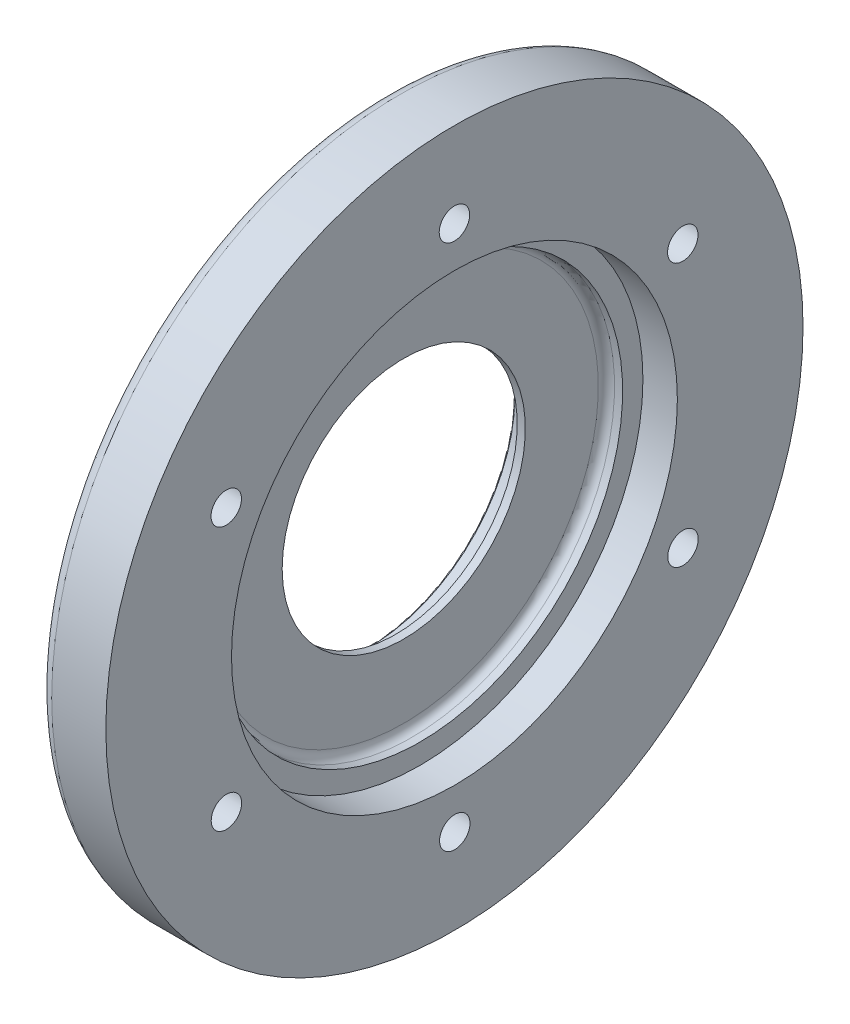
ISO-10303-21;
HEADER;
FILE_DESCRIPTION(('STEP AP214'),'2;1');
FILE_NAME('part.step','',(''),(''),'','','');
FILE_SCHEMA(('AUTOMOTIVE_DESIGN { 1 0 10303 214 1 1 1 1 }'));
ENDSEC;
DATA;
#1=APPLICATION_CONTEXT('core data for automotive mechanical design processes');
#2=APPLICATION_PROTOCOL_DEFINITION('international standard','automotive_design',2000,#1);
#3=PRODUCT_CONTEXT('',#1,'mechanical');
#4=PRODUCT('Part','Part','',(#3));
#5=PRODUCT_RELATED_PRODUCT_CATEGORY('part','',(#4));
#6=PRODUCT_DEFINITION_FORMATION('','',#4);
#7=PRODUCT_DEFINITION_CONTEXT('part definition',#1,'design');
#8=PRODUCT_DEFINITION('design','',#6,#7);
#9=PRODUCT_DEFINITION_SHAPE('','',#8);
#10=(LENGTH_UNIT() NAMED_UNIT(*) SI_UNIT(.MILLI.,.METRE.));
#11=(NAMED_UNIT(*) PLANE_ANGLE_UNIT() SI_UNIT($,.RADIAN.));
#12=(NAMED_UNIT(*) SI_UNIT($,.STERADIAN.) SOLID_ANGLE_UNIT());
#13=UNCERTAINTY_MEASURE_WITH_UNIT(LENGTH_MEASURE(1.E-05),#10,'distance_accuracy_value','');
#14=(GEOMETRIC_REPRESENTATION_CONTEXT(3) GLOBAL_UNCERTAINTY_ASSIGNED_CONTEXT((#13)) GLOBAL_UNIT_ASSIGNED_CONTEXT((#10,
#11,#12)) REPRESENTATION_CONTEXT('',''));
#15=CARTESIAN_POINT('',(0.,0.,0.));
#16=DIRECTION('',(0.,0.,1.));
#17=DIRECTION('',(1.,0.,0.));
#18=AXIS2_PLACEMENT_3D('',#15,#16,#17);
#19=CARTESIAN_POINT('',(0.595225647379466,0.,-36.));
#20=DIRECTION('',(1.,0.,0.));
#21=DIRECTION('',(0.,0.,-1.));
#22=AXIS2_PLACEMENT_3D('',#19,#20,#21);
#23=PLANE('',#22);
#24=CARTESIAN_POINT('',(0.595225647379467,0.,0.));
#25=DIRECTION('',(-1.,0.,0.));
#26=DIRECTION('',(0.,0.,1.));
#27=AXIS2_PLACEMENT_3D('',#24,#25,#26);
#28=CIRCLE('',#27,30.);
#29=CARTESIAN_POINT('',(0.595225647379467,0.,30.));
#30=VERTEX_POINT('',#29);
#31=EDGE_CURVE('E139',#30,#30,#28,.T.);
#32=ORIENTED_EDGE('',*,*,#31,.F.);
#33=EDGE_LOOP('',(#32));
#34=FACE_BOUND('',#33,.T.);
#35=CARTESIAN_POINT('',(0.595225647379466,0.,0.));
#36=DIRECTION('',(-1.,0.,0.));
#37=DIRECTION('',(0.,0.,1.));
#38=AXIS2_PLACEMENT_3D('',#35,#36,#37);
#39=CIRCLE('',#38,36.);
#40=CARTESIAN_POINT('',(0.595225647379466,0.,36.));
#41=VERTEX_POINT('',#40);
#42=EDGE_CURVE('E178',#41,#41,#39,.T.);
#43=ORIENTED_EDGE('',*,*,#42,.T.);
#44=EDGE_LOOP('',(#43));
#45=FACE_BOUND('',#44,.T.);
#46=ADVANCED_FACE('F47',(#34,#45),#23,.F.);
#47=CARTESIAN_POINT('',(0.,0.,0.));
#48=DIRECTION('',(-1.,0.,0.));
#49=DIRECTION('',(0.,0.,1.));
#50=AXIS2_PLACEMENT_3D('',#47,#48,#49);
#51=CYLINDRICAL_SURFACE('',#50,36.);
#52=CARTESIAN_POINT('',(-5.90477435262053,0.,0.));
#53=DIRECTION('',(1.,0.,0.));
#54=DIRECTION('',(0.,0.,-1.));
#55=AXIS2_PLACEMENT_3D('',#52,#53,#54);
#56=CIRCLE('',#55,36.);
#57=CARTESIAN_POINT('',(-5.90477435262053,0.,-36.));
#58=VERTEX_POINT('',#57);
#59=EDGE_CURVE('E62',#58,#58,#56,.F.);
#60=ORIENTED_EDGE('',*,*,#59,.T.);
#61=EDGE_LOOP('',(#60));
#62=FACE_BOUND('',#61,.T.);
#63=ORIENTED_EDGE('',*,*,#42,.F.);
#64=EDGE_LOOP('',(#63));
#65=FACE_BOUND('',#64,.T.);
#66=ADVANCED_FACE('F185',(#62,#65),#51,.F.);
#67=CARTESIAN_POINT('',(-6.40477435262053,0.,-46.));
#68=DIRECTION('',(1.,0.,0.));
#69=DIRECTION('',(0.,0.,-1.));
#70=AXIS2_PLACEMENT_3D('',#67,#68,#69);
#71=PLANE('',#70);
#72=CARTESIAN_POINT('',(-6.40477435262053,0.,0.));
#73=DIRECTION('',(1.,0.,0.));
#74=DIRECTION('',(0.,0.,-1.));
#75=AXIS2_PLACEMENT_3D('',#72,#73,#74);
#76=CIRCLE('',#75,36.5);
#77=CARTESIAN_POINT('',(-6.40477435262053,0.,-36.5));
#78=VERTEX_POINT('',#77);
#79=EDGE_CURVE('E56',#78,#78,#76,.T.);
#80=ORIENTED_EDGE('',*,*,#79,.T.);
#81=EDGE_LOOP('',(#80));
#82=FACE_BOUND('',#81,.T.);
#83=CARTESIAN_POINT('',(-6.40477435262053,0.,0.));
#84=DIRECTION('',(-1.,0.,0.));
#85=DIRECTION('',(0.,0.,1.));
#86=AXIS2_PLACEMENT_3D('',#83,#84,#85);
#87=CIRCLE('',#86,46.);
#88=CARTESIAN_POINT('',(-6.40477435262053,0.,46.));
#89=VERTEX_POINT('',#88);
#90=EDGE_CURVE('E174',#89,#89,#87,.T.);
#91=ORIENTED_EDGE('',*,*,#90,.T.);
#92=EDGE_LOOP('',(#91));
#93=FACE_BOUND('',#92,.T.);
#94=ADVANCED_FACE('F208',(#82,#93),#71,.F.);
#95=CARTESIAN_POINT('',(0.,0.,0.));
#96=DIRECTION('',(-1.,0.,0.));
#97=DIRECTION('',(0.,0.,1.));
#98=AXIS2_PLACEMENT_3D('',#95,#96,#97);
#99=CYLINDRICAL_SURFACE('',#98,46.);
#100=ORIENTED_EDGE('',*,*,#90,.F.);
#101=EDGE_LOOP('',(#100));
#102=FACE_BOUND('',#101,.T.);
#103=CARTESIAN_POINT('',(-5.25563941521427,0.,0.));
#104=DIRECTION('',(-1.,0.,0.));
#105=DIRECTION('',(0.,0.,1.));
#106=AXIS2_PLACEMENT_3D('',#103,#104,#105);
#107=CIRCLE('',#106,46.);
#108=CARTESIAN_POINT('',(-5.25563941521427,0.,46.));
#109=VERTEX_POINT('',#108);
#110=EDGE_CURVE('E170',#109,#109,#107,.T.);
#111=ORIENTED_EDGE('',*,*,#110,.T.);
#112=EDGE_LOOP('',(#111));
#113=FACE_BOUND('',#112,.T.);
#114=ADVANCED_FACE('F215',(#102,#113),#99,.T.);
#115=CARTESIAN_POINT('',(-5.25563941521427,0.,0.));
#116=DIRECTION('',(-1.,0.,0.));
#117=DIRECTION('',(0.,0.,1.));
#118=AXIS2_PLACEMENT_3D('',#115,#116,#117);
#119=TOROIDAL_SURFACE('',#118,49.,3.);
#120=ORIENTED_EDGE('',*,*,#110,.F.);
#121=EDGE_LOOP('',(#120));
#122=FACE_BOUND('',#121,.T.);
#123=CARTESIAN_POINT('',(-2.25563941521427,0.,0.));
#124=DIRECTION('',(-1.,0.,0.));
#125=DIRECTION('',(0.,0.,1.));
#126=AXIS2_PLACEMENT_3D('',#123,#124,#125);
#127=CIRCLE('',#126,49.);
#128=CARTESIAN_POINT('',(-2.25563941521427,0.,49.));
#129=VERTEX_POINT('',#128);
#130=EDGE_CURVE('E166',#129,#129,#127,.T.);
#131=ORIENTED_EDGE('',*,*,#130,.T.);
#132=EDGE_LOOP('',(#131));
#133=FACE_BOUND('',#132,.T.);
#134=ADVANCED_FACE('F219',(#122,#133),#119,.F.);
#135=CARTESIAN_POINT('',(-2.25563941521427,0.,-86.));
#136=DIRECTION('',(1.,0.,0.));
#137=DIRECTION('',(0.,0.,-1.));
#138=AXIS2_PLACEMENT_3D('',#135,#136,#137);
#139=PLANE('',#138);
#140=CARTESIAN_POINT('',(-2.25563941521428,65.0505102572168,0.));
#141=DIRECTION('',(-1.,0.,0.));
#142=DIRECTION('',(0.,0.,1.));
#143=AXIS2_PLACEMENT_3D('',#140,#141,#142);
#144=CIRCLE('',#143,5.99999999999999);
#145=CARTESIAN_POINT('',(-2.25563941521428,65.0505102572168,5.99999999999999));
#146=VERTEX_POINT('',#145);
#147=EDGE_CURVE('E308',#146,#146,#144,.T.);
#148=ORIENTED_EDGE('',*,*,#147,.F.);
#149=EDGE_LOOP('',(#148));
#150=FACE_BOUND('',#149,.T.);
#151=CARTESIAN_POINT('',(-2.25563941521428,32.5000000000024,56.2916512459899));
#152=DIRECTION('',(-1.,0.,0.));
#153=DIRECTION('',(0.,0.,1.));
#154=AXIS2_PLACEMENT_3D('',#151,#152,#153);
#155=CIRCLE('',#154,5.99999999999999);
#156=CARTESIAN_POINT('',(-2.25563941521428,32.5000000000024,62.2916512459899));
#157=VERTEX_POINT('',#156);
#158=EDGE_CURVE('E101',#157,#157,#155,.T.);
#159=ORIENTED_EDGE('',*,*,#158,.F.);
#160=EDGE_LOOP('',(#159));
#161=FACE_BOUND('',#160,.T.);
#162=CARTESIAN_POINT('',(-2.25563941521428,-32.525255128606,56.2479080800912));
#163=DIRECTION('',(-1.,0.,0.));
#164=DIRECTION('',(0.,0.,1.));
#165=AXIS2_PLACEMENT_3D('',#162,#163,#164);
#166=CIRCLE('',#165,5.99999999999999);
#167=CARTESIAN_POINT('',(-2.25563941521428,-32.525255128606,62.2479080800912));
#168=VERTEX_POINT('',#167);
#169=EDGE_CURVE('E92',#168,#168,#166,.T.);
#170=ORIENTED_EDGE('',*,*,#169,.F.);
#171=EDGE_LOOP('',(#170));
#172=FACE_BOUND('',#171,.T.);
#173=CARTESIAN_POINT('',(-2.25563941521428,-65.,-0.087486331797387));
#174=DIRECTION('',(-1.,0.,0.));
#175=DIRECTION('',(0.,0.,1.));
#176=AXIS2_PLACEMENT_3D('',#173,#174,#175);
#177=CIRCLE('',#176,5.99999999999999);
#178=CARTESIAN_POINT('',(-2.25563941521428,-65.,5.9125136682026));
#179=VERTEX_POINT('',#178);
#180=EDGE_CURVE('E87',#179,#179,#177,.T.);
#181=ORIENTED_EDGE('',*,*,#180,.F.);
#182=EDGE_LOOP('',(#181));
#183=FACE_BOUND('',#182,.T.);
#184=CARTESIAN_POINT('',(-2.25563941521428,-32.4494897427856,-56.3791375777873));
#185=DIRECTION('',(-1.,0.,0.));
#186=DIRECTION('',(0.,0.,1.));
#187=AXIS2_PLACEMENT_3D('',#184,#185,#186);
#188=CIRCLE('',#187,5.99999999999999);
#189=CARTESIAN_POINT('',(-2.25563941521428,-32.4494897427856,-50.3791375777873));
#190=VERTEX_POINT('',#189);
#191=EDGE_CURVE('E82',#190,#190,#188,.T.);
#192=ORIENTED_EDGE('',*,*,#191,.F.);
#193=EDGE_LOOP('',(#192));
#194=FACE_BOUND('',#193,.T.);
#195=CARTESIAN_POINT('',(-2.25563941521428,32.5757653858228,-56.3353944118886));
#196=DIRECTION('',(-1.,0.,0.));
#197=DIRECTION('',(0.,0.,1.));
#198=AXIS2_PLACEMENT_3D('',#195,#196,#197);
#199=CIRCLE('',#198,5.99999999999998);
#200=CARTESIAN_POINT('',(-2.25563941521428,32.5757653858228,-50.3353944118886));
#201=VERTEX_POINT('',#200);
#202=EDGE_CURVE('E76',#201,#201,#199,.T.);
#203=ORIENTED_EDGE('',*,*,#202,.F.);
#204=EDGE_LOOP('',(#203));
#205=FACE_BOUND('',#204,.T.);
#206=CARTESIAN_POINT('',(-2.25563941521427,0.,0.));
#207=DIRECTION('',(1.,0.,0.));
#208=DIRECTION('',(0.,0.,-1.));
#209=AXIS2_PLACEMENT_3D('',#206,#207,#208);
#210=CIRCLE('',#209,81.1010205144336);
#211=CARTESIAN_POINT('',(-2.25563941521427,0.,-81.1010205144336));
#212=VERTEX_POINT('',#211);
#213=EDGE_CURVE('E10',#212,#212,#210,.F.);
#214=ORIENTED_EDGE('',*,*,#213,.T.);
#215=EDGE_LOOP('',(#214));
#216=FACE_BOUND('',#215,.T.);
#217=ORIENTED_EDGE('',*,*,#130,.F.);
#218=EDGE_LOOP('',(#217));
#219=FACE_BOUND('',#218,.T.);
#220=ADVANCED_FACE('F223',(#150,#161,#172,#183,#194,#205,#216,#219),#139,.F.);
#221=CARTESIAN_POINT('',(6.59522564737947,0.,-50.));
#222=DIRECTION('',(-1.,0.,0.));
#223=DIRECTION('',(0.,0.,1.));
#224=AXIS2_PLACEMENT_3D('',#221,#222,#223);
#225=PLANE('',#224);
#226=CARTESIAN_POINT('',(6.59522564737947,0.,0.));
#227=DIRECTION('',(-1.,0.,0.));
#228=DIRECTION('',(0.,0.,1.));
#229=AXIS2_PLACEMENT_3D('',#226,#227,#228);
#230=CIRCLE('',#229,55.);
#231=CARTESIAN_POINT('',(6.59522564737947,0.,55.));
#232=VERTEX_POINT('',#231);
#233=EDGE_CURVE('E162',#232,#232,#230,.T.);
#234=ORIENTED_EDGE('',*,*,#233,.F.);
#235=EDGE_LOOP('',(#234));
#236=FACE_BOUND('',#235,.T.);
#237=CARTESIAN_POINT('',(6.59522564737947,0.,0.));
#238=DIRECTION('',(-1.,0.,0.));
#239=DIRECTION('',(0.,0.,1.));
#240=AXIS2_PLACEMENT_3D('',#237,#238,#239);
#241=CIRCLE('',#240,50.);
#242=CARTESIAN_POINT('',(6.59522564737947,0.,50.));
#243=VERTEX_POINT('',#242);
#244=EDGE_CURVE('E158',#243,#243,#241,.T.);
#245=ORIENTED_EDGE('',*,*,#244,.T.);
#246=EDGE_LOOP('',(#245));
#247=FACE_BOUND('',#246,.T.);
#248=ADVANCED_FACE('F227',(#236,#247),#225,.F.);
#249=CARTESIAN_POINT('',(0.,0.,0.));
#250=DIRECTION('',(-1.,0.,0.));
#251=DIRECTION('',(0.,0.,1.));
#252=AXIS2_PLACEMENT_3D('',#249,#250,#251);
#253=CYLINDRICAL_SURFACE('',#252,50.);
#254=ORIENTED_EDGE('',*,*,#244,.F.);
#255=EDGE_LOOP('',(#254));
#256=FACE_BOUND('',#255,.T.);
#257=CARTESIAN_POINT('',(4.59522564737947,0.,0.));
#258=DIRECTION('',(-1.,0.,0.));
#259=DIRECTION('',(0.,0.,1.));
#260=AXIS2_PLACEMENT_3D('',#257,#258,#259);
#261=CIRCLE('',#260,50.);
#262=CARTESIAN_POINT('',(4.59522564737947,0.,50.));
#263=VERTEX_POINT('',#262);
#264=EDGE_CURVE('E154',#263,#263,#261,.T.);
#265=ORIENTED_EDGE('',*,*,#264,.T.);
#266=EDGE_LOOP('',(#265));
#267=FACE_BOUND('',#266,.T.);
#268=ADVANCED_FACE('F231',(#256,#267),#253,.F.);
#269=CARTESIAN_POINT('',(4.59522564737947,0.,0.));
#270=DIRECTION('',(-1.,0.,0.));
#271=DIRECTION('',(0.,0.,1.));
#272=AXIS2_PLACEMENT_3D('',#269,#270,#271);
#273=TOROIDAL_SURFACE('',#272,48.,2.);
#274=ORIENTED_EDGE('',*,*,#264,.F.);
#275=EDGE_LOOP('',(#274));
#276=FACE_BOUND('',#275,.T.);
#277=CARTESIAN_POINT('',(2.59522564737947,0.,0.));
#278=DIRECTION('',(-1.,0.,0.));
#279=DIRECTION('',(0.,0.,1.));
#280=AXIS2_PLACEMENT_3D('',#277,#278,#279);
#281=CIRCLE('',#280,48.);
#282=CARTESIAN_POINT('',(2.59522564737947,0.,48.));
#283=VERTEX_POINT('',#282);
#284=EDGE_CURVE('E150',#283,#283,#281,.T.);
#285=ORIENTED_EDGE('',*,*,#284,.T.);
#286=EDGE_LOOP('',(#285));
#287=FACE_BOUND('',#286,.T.);
#288=ADVANCED_FACE('F235',(#276,#287),#273,.F.);
#289=CARTESIAN_POINT('',(2.59522564737947,0.,-30.));
#290=DIRECTION('',(-1.,0.,0.));
#291=DIRECTION('',(0.,0.,1.));
#292=AXIS2_PLACEMENT_3D('',#289,#290,#291);
#293=PLANE('',#292);
#294=ORIENTED_EDGE('',*,*,#284,.F.);
#295=EDGE_LOOP('',(#294));
#296=FACE_BOUND('',#295,.T.);
#297=CARTESIAN_POINT('',(2.59522564737947,0.,0.));
#298=DIRECTION('',(-1.,0.,0.));
#299=DIRECTION('',(0.,0.,1.));
#300=AXIS2_PLACEMENT_3D('',#297,#298,#299);
#301=CIRCLE('',#300,30.);
#302=CARTESIAN_POINT('',(2.59522564737947,0.,30.));
#303=VERTEX_POINT('',#302);
#304=EDGE_CURVE('E146',#303,#303,#301,.T.);
#305=ORIENTED_EDGE('',*,*,#304,.T.);
#306=EDGE_LOOP('',(#305));
#307=FACE_BOUND('',#306,.T.);
#308=ADVANCED_FACE('F198',(#296,#307),#293,.F.);
#309=CARTESIAN_POINT('',(0.,0.,0.));
#310=DIRECTION('',(-1.,0.,0.));
#311=DIRECTION('',(0.,0.,1.));
#312=AXIS2_PLACEMENT_3D('',#309,#310,#311);
#313=CYLINDRICAL_SURFACE('',#312,30.);
#314=ORIENTED_EDGE('',*,*,#304,.F.);
#315=EDGE_LOOP('',(#314));
#316=FACE_BOUND('',#315,.T.);
#317=ORIENTED_EDGE('',*,*,#31,.T.);
#318=EDGE_LOOP('',(#317));
#319=FACE_BOUND('',#318,.T.);
#320=ADVANCED_FACE('F190',(#316,#319),#313,.F.);
#321=CARTESIAN_POINT('',(-5.90477435262053,0.,0.));
#322=DIRECTION('',(1.,0.,0.));
#323=DIRECTION('',(0.,0.,-1.));
#324=AXIS2_PLACEMENT_3D('',#321,#322,#323);
#325=TOROIDAL_SURFACE('',#324,36.5,0.5);
#326=ORIENTED_EDGE('',*,*,#79,.F.);
#327=EDGE_LOOP('',(#326));
#328=FACE_BOUND('',#327,.T.);
#329=ORIENTED_EDGE('',*,*,#59,.F.);
#330=EDGE_LOOP('',(#329));
#331=FACE_BOUND('',#330,.T.);
#332=ADVANCED_FACE('F188',(#328,#331),#325,.T.);
#333=CARTESIAN_POINT('',(2.74436058478573,0.,0.));
#334=DIRECTION('',(-1.,0.,0.));
#335=DIRECTION('',(0.,0.,1.));
#336=AXIS2_PLACEMENT_3D('',#333,#334,#335);
#337=TOROIDAL_SURFACE('',#336,81.1010205144336,5.);
#338=CARTESIAN_POINT('',(1.74436058478572,0.,0.));
#339=DIRECTION('',(1.,0.,0.));
#340=DIRECTION('',(0.,0.,-1.));
#341=AXIS2_PLACEMENT_3D('',#338,#339,#340);
#342=CIRCLE('',#341,86.);
#343=CARTESIAN_POINT('',(1.74436058478572,0.,-86.));
#344=VERTEX_POINT('',#343);
#345=EDGE_CURVE('E134',#344,#344,#342,.T.);
#346=ORIENTED_EDGE('',*,*,#345,.F.);
#347=EDGE_LOOP('',(#346));
#348=FACE_BOUND('',#347,.T.);
#349=ORIENTED_EDGE('',*,*,#213,.F.);
#350=EDGE_LOOP('',(#349));
#351=FACE_BOUND('',#350,.T.);
#352=ADVANCED_FACE('F49',(#348,#351),#337,.T.);
#353=CARTESIAN_POINT('',(15.0943605847857,0.,0.));
#354=DIRECTION('',(-1.,0.,0.));
#355=DIRECTION('',(0.,0.,1.));
#356=AXIS2_PLACEMENT_3D('',#353,#354,#355);
#357=CYLINDRICAL_SURFACE('',#356,55.);
#358=CARTESIAN_POINT('',(15.0943605847857,0.,0.));
#359=DIRECTION('',(1.,0.,0.));
#360=DIRECTION('',(0.,0.,-1.));
#361=AXIS2_PLACEMENT_3D('',#358,#359,#360);
#362=CIRCLE('',#361,55.);
#363=CARTESIAN_POINT('',(15.0943605847857,0.,-55.));
#364=VERTEX_POINT('',#363);
#365=EDGE_CURVE('E70',#364,#364,#362,.T.);
#366=ORIENTED_EDGE('',*,*,#365,.T.);
#367=EDGE_LOOP('',(#366));
#368=FACE_BOUND('',#367,.T.);
#369=ORIENTED_EDGE('',*,*,#233,.T.);
#370=EDGE_LOOP('',(#369));
#371=FACE_BOUND('',#370,.T.);
#372=ADVANCED_FACE('F196',(#368,#371),#357,.F.);
#373=CARTESIAN_POINT('',(15.0943605847857,0.,0.));
#374=DIRECTION('',(1.,0.,0.));
#375=DIRECTION('',(0.,0.,-1.));
#376=AXIS2_PLACEMENT_3D('',#373,#374,#375);
#377=PLANE('',#376);
#378=CARTESIAN_POINT('',(15.0943605847857,65.0505102572168,0.));
#379=DIRECTION('',(1.,0.,0.));
#380=DIRECTION('',(0.,0.,-1.));
#381=AXIS2_PLACEMENT_3D('',#378,#379,#380);
#382=CIRCLE('',#381,3.7532226988268);
#383=CARTESIAN_POINT('',(15.0943605847857,65.0505102572168,-3.7532226988268));
#384=VERTEX_POINT('',#383);
#385=EDGE_CURVE('E51',#384,#384,#382,.T.);
#386=ORIENTED_EDGE('',*,*,#385,.F.);
#387=EDGE_LOOP('',(#386));
#388=FACE_BOUND('',#387,.T.);
#389=CARTESIAN_POINT('',(15.0943605847857,32.5000000000024,56.2916512459899));
#390=DIRECTION('',(1.,0.,0.));
#391=DIRECTION('',(0.,0.,-1.));
#392=AXIS2_PLACEMENT_3D('',#389,#390,#391);
#393=CIRCLE('',#392,3.7532226988268);
#394=CARTESIAN_POINT('',(15.0943605847857,32.5000000000024,52.5384285471631));
#395=VERTEX_POINT('',#394);
#396=EDGE_CURVE('E89',#395,#395,#393,.T.);
#397=ORIENTED_EDGE('',*,*,#396,.F.);
#398=EDGE_LOOP('',(#397));
#399=FACE_BOUND('',#398,.T.);
#400=CARTESIAN_POINT('',(15.0943605847857,-32.525255128606,56.2479080800912));
#401=DIRECTION('',(1.,0.,0.));
#402=DIRECTION('',(0.,0.,-1.));
#403=AXIS2_PLACEMENT_3D('',#400,#401,#402);
#404=CIRCLE('',#403,3.7532226988268);
#405=CARTESIAN_POINT('',(15.0943605847857,-32.525255128606,52.4946853812644));
#406=VERTEX_POINT('',#405);
#407=EDGE_CURVE('E84',#406,#406,#404,.T.);
#408=ORIENTED_EDGE('',*,*,#407,.F.);
#409=EDGE_LOOP('',(#408));
#410=FACE_BOUND('',#409,.T.);
#411=CARTESIAN_POINT('',(15.0943605847857,-65.,-0.087486331797387));
#412=DIRECTION('',(1.,0.,0.));
#413=DIRECTION('',(0.,0.,-1.));
#414=AXIS2_PLACEMENT_3D('',#411,#412,#413);
#415=CIRCLE('',#414,3.7532226988268);
#416=CARTESIAN_POINT('',(15.0943605847857,-65.,-3.84070903062418));
#417=VERTEX_POINT('',#416);
#418=EDGE_CURVE('E78',#417,#417,#415,.T.);
#419=ORIENTED_EDGE('',*,*,#418,.F.);
#420=EDGE_LOOP('',(#419));
#421=FACE_BOUND('',#420,.T.);
#422=CARTESIAN_POINT('',(15.0943605847857,-32.4494897427856,-56.3791375777873));
#423=DIRECTION('',(1.,0.,0.));
#424=DIRECTION('',(0.,0.,-1.));
#425=AXIS2_PLACEMENT_3D('',#422,#423,#424);
#426=CIRCLE('',#425,3.7532226988268);
#427=CARTESIAN_POINT('',(15.0943605847857,-32.4494897427856,-60.1323602766141));
#428=VERTEX_POINT('',#427);
#429=EDGE_CURVE('E72',#428,#428,#426,.T.);
#430=ORIENTED_EDGE('',*,*,#429,.F.);
#431=EDGE_LOOP('',(#430));
#432=FACE_BOUND('',#431,.T.);
#433=CARTESIAN_POINT('',(15.0943605847857,32.5757653858228,-56.3353944118886));
#434=DIRECTION('',(1.,0.,0.));
#435=DIRECTION('',(0.,0.,-1.));
#436=AXIS2_PLACEMENT_3D('',#433,#434,#435);
#437=CIRCLE('',#436,3.7532226988268);
#438=CARTESIAN_POINT('',(15.0943605847857,32.5757653858228,-60.0886171107154));
#439=VERTEX_POINT('',#438);
#440=EDGE_CURVE('E66',#439,#439,#437,.T.);
#441=ORIENTED_EDGE('',*,*,#440,.F.);
#442=EDGE_LOOP('',(#441));
#443=FACE_BOUND('',#442,.T.);
#444=CARTESIAN_POINT('',(15.0943605847857,0.,0.));
#445=DIRECTION('',(1.,0.,0.));
#446=DIRECTION('',(0.,0.,-1.));
#447=AXIS2_PLACEMENT_3D('',#444,#445,#446);
#448=CIRCLE('',#447,86.);
#449=CARTESIAN_POINT('',(15.0943605847857,0.,-86.));
#450=VERTEX_POINT('',#449);
#451=EDGE_CURVE('E135',#450,#450,#448,.T.);
#452=ORIENTED_EDGE('',*,*,#451,.T.);
#453=EDGE_LOOP('',(#452));
#454=FACE_BOUND('',#453,.T.);
#455=ORIENTED_EDGE('',*,*,#365,.F.);
#456=EDGE_LOOP('',(#455));
#457=FACE_BOUND('',#456,.T.);
#458=ADVANCED_FACE('F247',(#388,#399,#410,#421,#432,#443,#454,#457),#377,.T.);
#459=CARTESIAN_POINT('',(15.0943605847857,0.,0.));
#460=DIRECTION('',(-1.,0.,0.));
#461=DIRECTION('',(0.,0.,1.));
#462=AXIS2_PLACEMENT_3D('',#459,#460,#461);
#463=CYLINDRICAL_SURFACE('',#462,86.);
#464=ORIENTED_EDGE('',*,*,#451,.F.);
#465=EDGE_LOOP('',(#464));
#466=FACE_BOUND('',#465,.T.);
#467=ORIENTED_EDGE('',*,*,#345,.T.);
#468=EDGE_LOOP('',(#467));
#469=FACE_BOUND('',#468,.T.);
#470=ADVANCED_FACE('F243',(#466,#469),#463,.T.);
#471=CARTESIAN_POINT('',(13.7443605847857,32.5757653858228,-56.3353944118886));
#472=DIRECTION('',(-1.,0.,0.));
#473=DIRECTION('',(0.,0.,1.));
#474=AXIS2_PLACEMENT_3D('',#471,#472,#473);
#475=CONICAL_SURFACE('',#474,6.,1.02974425867665);
#476=ORIENTED_EDGE('',*,*,#440,.T.);
#477=EDGE_LOOP('',(#476));
#478=FACE_BOUND('',#477,.T.);
#479=CARTESIAN_POINT('',(13.7443605847857,32.5757653858228,-56.3353944118886));
#480=DIRECTION('',(-1.,0.,0.));
#481=DIRECTION('',(0.,0.,1.));
#482=AXIS2_PLACEMENT_3D('',#479,#480,#481);
#483=CIRCLE('',#482,6.);
#484=CARTESIAN_POINT('',(13.7443605847857,32.5757653858228,-50.3353944118886));
#485=VERTEX_POINT('',#484);
#486=EDGE_CURVE('E71',#485,#485,#483,.T.);
#487=ORIENTED_EDGE('',*,*,#486,.T.);
#488=EDGE_LOOP('',(#487));
#489=FACE_BOUND('',#488,.T.);
#490=ADVANCED_FACE('F246',(#478,#489),#475,.F.);
#491=CARTESIAN_POINT('',(-2.25563941521427,32.5757653858228,-56.3353944118886));
#492=DIRECTION('',(-1.,0.,0.));
#493=DIRECTION('',(0.,0.,1.));
#494=AXIS2_PLACEMENT_3D('',#491,#492,#493);
#495=CYLINDRICAL_SURFACE('',#494,5.99999999999999);
#496=ORIENTED_EDGE('',*,*,#486,.F.);
#497=EDGE_LOOP('',(#496));
#498=FACE_BOUND('',#497,.T.);
#499=ORIENTED_EDGE('',*,*,#202,.T.);
#500=EDGE_LOOP('',(#499));
#501=FACE_BOUND('',#500,.T.);
#502=ADVANCED_FACE('F257',(#498,#501),#495,.F.);
#503=CARTESIAN_POINT('',(13.7443605847857,-32.4494897427856,-56.3791375777873));
#504=DIRECTION('',(-1.,0.,0.));
#505=DIRECTION('',(0.,0.,1.));
#506=AXIS2_PLACEMENT_3D('',#503,#504,#505);
#507=CONICAL_SURFACE('',#506,5.99999999999999,1.02974425867665);
#508=ORIENTED_EDGE('',*,*,#429,.T.);
#509=EDGE_LOOP('',(#508));
#510=FACE_BOUND('',#509,.T.);
#511=CARTESIAN_POINT('',(13.7443605847857,-32.4494897427856,-56.3791375777873));
#512=DIRECTION('',(-1.,0.,0.));
#513=DIRECTION('',(0.,0.,1.));
#514=AXIS2_PLACEMENT_3D('',#511,#512,#513);
#515=CIRCLE('',#514,5.99999999999999);
#516=CARTESIAN_POINT('',(13.7443605847857,-32.4494897427856,-50.3791375777873));
#517=VERTEX_POINT('',#516);
#518=EDGE_CURVE('E77',#517,#517,#515,.T.);
#519=ORIENTED_EDGE('',*,*,#518,.T.);
#520=EDGE_LOOP('',(#519));
#521=FACE_BOUND('',#520,.T.);
#522=ADVANCED_FACE('F261',(#510,#521),#507,.F.);
#523=CARTESIAN_POINT('',(-2.25563941521427,-32.4494897427856,-56.3791375777873));
#524=DIRECTION('',(-1.,0.,0.));
#525=DIRECTION('',(0.,0.,1.));
#526=AXIS2_PLACEMENT_3D('',#523,#524,#525);
#527=CYLINDRICAL_SURFACE('',#526,5.99999999999999);
#528=ORIENTED_EDGE('',*,*,#518,.F.);
#529=EDGE_LOOP('',(#528));
#530=FACE_BOUND('',#529,.T.);
#531=ORIENTED_EDGE('',*,*,#191,.T.);
#532=EDGE_LOOP('',(#531));
#533=FACE_BOUND('',#532,.T.);
#534=ADVANCED_FACE('F265',(#530,#533),#527,.F.);
#535=CARTESIAN_POINT('',(13.7443605847857,-65.,-0.087486331797387));
#536=DIRECTION('',(-1.,0.,0.));
#537=DIRECTION('',(0.,0.,1.));
#538=AXIS2_PLACEMENT_3D('',#535,#536,#537);
#539=CONICAL_SURFACE('',#538,5.99999999999999,1.02974425867665);
#540=ORIENTED_EDGE('',*,*,#418,.T.);
#541=EDGE_LOOP('',(#540));
#542=FACE_BOUND('',#541,.T.);
#543=CARTESIAN_POINT('',(13.7443605847857,-65.,-0.087486331797387));
#544=DIRECTION('',(-1.,0.,0.));
#545=DIRECTION('',(0.,0.,1.));
#546=AXIS2_PLACEMENT_3D('',#543,#544,#545);
#547=CIRCLE('',#546,5.99999999999999);
#548=CARTESIAN_POINT('',(13.7443605847857,-65.,5.9125136682026));
#549=VERTEX_POINT('',#548);
#550=EDGE_CURVE('E83',#549,#549,#547,.T.);
#551=ORIENTED_EDGE('',*,*,#550,.T.);
#552=EDGE_LOOP('',(#551));
#553=FACE_BOUND('',#552,.T.);
#554=ADVANCED_FACE('F269',(#542,#553),#539,.F.);
#555=CARTESIAN_POINT('',(-2.25563941521427,-65.,-0.087486331797387));
#556=DIRECTION('',(-1.,0.,0.));
#557=DIRECTION('',(0.,0.,1.));
#558=AXIS2_PLACEMENT_3D('',#555,#556,#557);
#559=CYLINDRICAL_SURFACE('',#558,5.99999999999999);
#560=ORIENTED_EDGE('',*,*,#550,.F.);
#561=EDGE_LOOP('',(#560));
#562=FACE_BOUND('',#561,.T.);
#563=ORIENTED_EDGE('',*,*,#180,.T.);
#564=EDGE_LOOP('',(#563));
#565=FACE_BOUND('',#564,.T.);
#566=ADVANCED_FACE('F273',(#562,#565),#559,.F.);
#567=CARTESIAN_POINT('',(13.7443605847857,-32.525255128606,56.2479080800912));
#568=DIRECTION('',(-1.,0.,0.));
#569=DIRECTION('',(0.,0.,1.));
#570=AXIS2_PLACEMENT_3D('',#567,#568,#569);
#571=CONICAL_SURFACE('',#570,5.99999999999999,1.02974425867665);
#572=ORIENTED_EDGE('',*,*,#407,.T.);
#573=EDGE_LOOP('',(#572));
#574=FACE_BOUND('',#573,.T.);
#575=CARTESIAN_POINT('',(13.7443605847857,-32.525255128606,56.2479080800912));
#576=DIRECTION('',(-1.,0.,0.));
#577=DIRECTION('',(0.,0.,1.));
#578=AXIS2_PLACEMENT_3D('',#575,#576,#577);
#579=CIRCLE('',#578,5.99999999999999);
#580=CARTESIAN_POINT('',(13.7443605847857,-32.525255128606,62.2479080800912));
#581=VERTEX_POINT('',#580);
#582=EDGE_CURVE('E88',#581,#581,#579,.T.);
#583=ORIENTED_EDGE('',*,*,#582,.T.);
#584=EDGE_LOOP('',(#583));
#585=FACE_BOUND('',#584,.T.);
#586=ADVANCED_FACE('F277',(#574,#585),#571,.F.);
#587=CARTESIAN_POINT('',(-2.25563941521427,-32.525255128606,56.2479080800912));
#588=DIRECTION('',(-1.,0.,0.));
#589=DIRECTION('',(0.,0.,1.));
#590=AXIS2_PLACEMENT_3D('',#587,#588,#589);
#591=CYLINDRICAL_SURFACE('',#590,5.99999999999999);
#592=ORIENTED_EDGE('',*,*,#582,.F.);
#593=EDGE_LOOP('',(#592));
#594=FACE_BOUND('',#593,.T.);
#595=ORIENTED_EDGE('',*,*,#169,.T.);
#596=EDGE_LOOP('',(#595));
#597=FACE_BOUND('',#596,.T.);
#598=ADVANCED_FACE('F281',(#594,#597),#591,.F.);
#599=CARTESIAN_POINT('',(13.7443605847857,32.5000000000024,56.2916512459899));
#600=DIRECTION('',(-1.,0.,0.));
#601=DIRECTION('',(0.,0.,1.));
#602=AXIS2_PLACEMENT_3D('',#599,#600,#601);
#603=CONICAL_SURFACE('',#602,5.99999999999999,1.02974425867665);
#604=ORIENTED_EDGE('',*,*,#396,.T.);
#605=EDGE_LOOP('',(#604));
#606=FACE_BOUND('',#605,.T.);
#607=CARTESIAN_POINT('',(13.7443605847857,32.5000000000024,56.2916512459899));
#608=DIRECTION('',(-1.,0.,0.));
#609=DIRECTION('',(0.,0.,1.));
#610=AXIS2_PLACEMENT_3D('',#607,#608,#609);
#611=CIRCLE('',#610,5.99999999999999);
#612=CARTESIAN_POINT('',(13.7443605847857,32.5000000000024,62.2916512459899));
#613=VERTEX_POINT('',#612);
#614=EDGE_CURVE('E93',#613,#613,#611,.T.);
#615=ORIENTED_EDGE('',*,*,#614,.T.);
#616=EDGE_LOOP('',(#615));
#617=FACE_BOUND('',#616,.T.);
#618=ADVANCED_FACE('F285',(#606,#617),#603,.F.);
#619=CARTESIAN_POINT('',(-2.25563941521427,32.5000000000024,56.2916512459899));
#620=DIRECTION('',(-1.,0.,0.));
#621=DIRECTION('',(0.,0.,1.));
#622=AXIS2_PLACEMENT_3D('',#619,#620,#621);
#623=CYLINDRICAL_SURFACE('',#622,5.99999999999999);
#624=ORIENTED_EDGE('',*,*,#614,.F.);
#625=EDGE_LOOP('',(#624));
#626=FACE_BOUND('',#625,.T.);
#627=ORIENTED_EDGE('',*,*,#158,.T.);
#628=EDGE_LOOP('',(#627));
#629=FACE_BOUND('',#628,.T.);
#630=ADVANCED_FACE('F289',(#626,#629),#623,.F.);
#631=CARTESIAN_POINT('',(13.7443605847857,65.0505102572168,0.));
#632=DIRECTION('',(-1.,0.,0.));
#633=DIRECTION('',(0.,0.,1.));
#634=AXIS2_PLACEMENT_3D('',#631,#632,#633);
#635=CONICAL_SURFACE('',#634,5.99999999999999,1.02974425867665);
#636=ORIENTED_EDGE('',*,*,#385,.T.);
#637=EDGE_LOOP('',(#636));
#638=FACE_BOUND('',#637,.T.);
#639=CARTESIAN_POINT('',(13.7443605847857,65.0505102572168,0.));
#640=DIRECTION('',(-1.,0.,0.));
#641=DIRECTION('',(0.,0.,1.));
#642=AXIS2_PLACEMENT_3D('',#639,#640,#641);
#643=CIRCLE('',#642,5.99999999999999);
#644=CARTESIAN_POINT('',(13.7443605847857,65.0505102572168,5.99999999999999));
#645=VERTEX_POINT('',#644);
#646=EDGE_CURVE('E305',#645,#645,#643,.T.);
#647=ORIENTED_EDGE('',*,*,#646,.T.);
#648=EDGE_LOOP('',(#647));
#649=FACE_BOUND('',#648,.T.);
#650=ADVANCED_FACE('F292',(#638,#649),#635,.F.);
#651=CARTESIAN_POINT('',(-2.25563941521427,65.0505102572168,0.));
#652=DIRECTION('',(-1.,0.,0.));
#653=DIRECTION('',(0.,0.,1.));
#654=AXIS2_PLACEMENT_3D('',#651,#652,#653);
#655=CYLINDRICAL_SURFACE('',#654,5.99999999999999);
#656=ORIENTED_EDGE('',*,*,#646,.F.);
#657=EDGE_LOOP('',(#656));
#658=FACE_BOUND('',#657,.T.);
#659=ORIENTED_EDGE('',*,*,#147,.T.);
#660=EDGE_LOOP('',(#659));
#661=FACE_BOUND('',#660,.T.);
#662=ADVANCED_FACE('F296',(#658,#661),#655,.F.);
#663=CLOSED_SHELL('',(#46,#66,#94,#114,#134,#220,#248,#268,#288,#308,#320,#332,#352,#372,#458,
#470,#490,#502,#522,#534,#554,#566,#586,#598,#618,#630,#650,#662));
#664=MANIFOLD_SOLID_BREP('B2',#663);
#665=ADVANCED_BREP_SHAPE_REPRESENTATION('',(#18,#664),#14);
#666=SHAPE_DEFINITION_REPRESENTATION(#9,#665);
ENDSEC;
END-ISO-10303-21;
